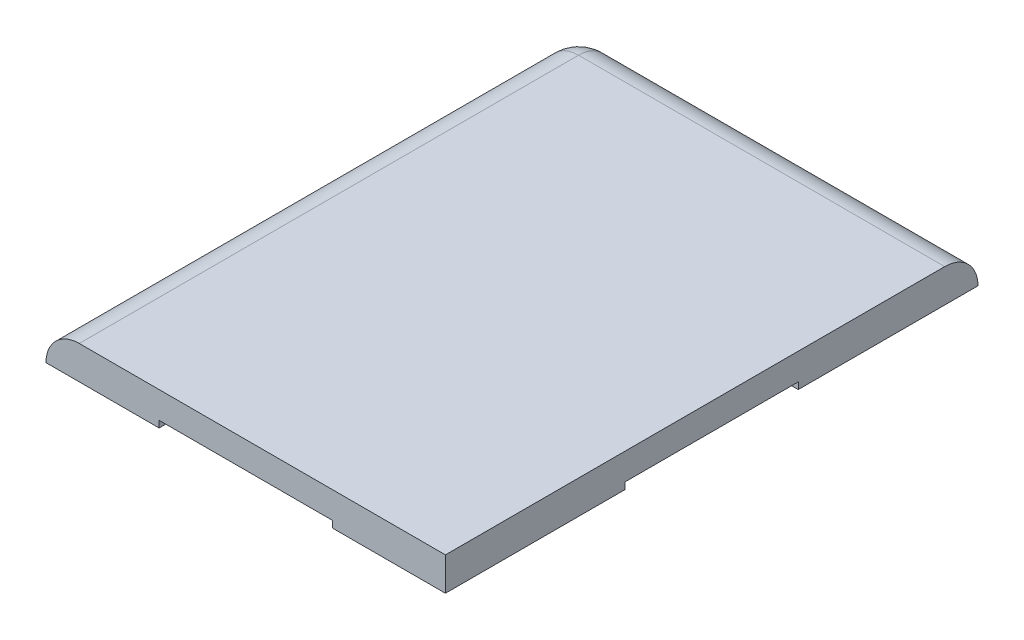
ISO-10303-21;
HEADER;
FILE_DESCRIPTION(('STEP AP214'),'2;1');
FILE_NAME('part.step','',(''),(''),'','','');
FILE_SCHEMA(('AUTOMOTIVE_DESIGN { 1 0 10303 214 1 1 1 1 }'));
ENDSEC;
DATA;
#1=APPLICATION_CONTEXT('core data for automotive mechanical design processes');
#2=APPLICATION_PROTOCOL_DEFINITION('international standard','automotive_design',2000,#1);
#3=PRODUCT_CONTEXT('',#1,'mechanical');
#4=PRODUCT('Part','Part','',(#3));
#5=PRODUCT_RELATED_PRODUCT_CATEGORY('part','',(#4));
#6=PRODUCT_DEFINITION_FORMATION('','',#4);
#7=PRODUCT_DEFINITION_CONTEXT('part definition',#1,'design');
#8=PRODUCT_DEFINITION('design','',#6,#7);
#9=PRODUCT_DEFINITION_SHAPE('','',#8);
#10=(LENGTH_UNIT() NAMED_UNIT(*) SI_UNIT(.MILLI.,.METRE.));
#11=(NAMED_UNIT(*) PLANE_ANGLE_UNIT() SI_UNIT($,.RADIAN.));
#12=(NAMED_UNIT(*) SI_UNIT($,.STERADIAN.) SOLID_ANGLE_UNIT());
#13=UNCERTAINTY_MEASURE_WITH_UNIT(LENGTH_MEASURE(1.E-05),#10,'distance_accuracy_value','');
#14=(GEOMETRIC_REPRESENTATION_CONTEXT(3) GLOBAL_UNCERTAINTY_ASSIGNED_CONTEXT((#13)) GLOBAL_UNIT_ASSIGNED_CONTEXT((#10,
#11,#12)) REPRESENTATION_CONTEXT('',''));
#15=CARTESIAN_POINT('',(0.,0.,0.));
#16=DIRECTION('',(0.,0.,1.));
#17=DIRECTION('',(1.,0.,0.));
#18=AXIS2_PLACEMENT_3D('',#15,#16,#17);
#19=CARTESIAN_POINT('',(0.,10.,0.));
#20=DIRECTION('',(0.,0.,-1.));
#21=DIRECTION('',(-1.,0.,0.));
#22=AXIS2_PLACEMENT_3D('',#19,#20,#21);
#23=PLANE('',#22);
#24=DIRECTION('',(1.,0.,0.));
#25=VECTOR('',#24,1.);
#26=CARTESIAN_POINT('',(0.,0.,0.));
#27=LINE('',#26,#25);
#28=CARTESIAN_POINT('',(0.,0.,0.));
#29=VERTEX_POINT('',#28);
#30=CARTESIAN_POINT('',(34.,0.,0.));
#31=VERTEX_POINT('',#30);
#32=EDGE_CURVE('E206',#29,#31,#27,.T.);
#33=ORIENTED_EDGE('',*,*,#32,.T.);
#34=DIRECTION('',(0.,-1.,0.));
#35=VECTOR('',#34,1.);
#36=CARTESIAN_POINT('',(34.,2.,0.));
#37=LINE('',#36,#35);
#38=CARTESIAN_POINT('',(34.,2.,0.));
#39=VERTEX_POINT('',#38);
#40=EDGE_CURVE('E157',#39,#31,#37,.T.);
#41=ORIENTED_EDGE('',*,*,#40,.F.);
#42=DIRECTION('',(-1.,0.,0.));
#43=VECTOR('',#42,1.);
#44=CARTESIAN_POINT('',(34.,2.,0.));
#45=LINE('',#44,#43);
#46=CARTESIAN_POINT('',(86.,2.,0.));
#47=VERTEX_POINT('',#46);
#48=EDGE_CURVE('E135',#47,#39,#45,.T.);
#49=ORIENTED_EDGE('',*,*,#48,.F.);
#50=DIRECTION('',(0.,-1.,0.));
#51=VECTOR('',#50,1.);
#52=CARTESIAN_POINT('',(86.,2.,0.));
#53=LINE('',#52,#51);
#54=CARTESIAN_POINT('',(86.,0.,0.));
#55=VERTEX_POINT('',#54);
#56=EDGE_CURVE('E160',#47,#55,#53,.T.);
#57=ORIENTED_EDGE('',*,*,#56,.T.);
#58=CARTESIAN_POINT('',(120.,0.,0.));
#59=VERTEX_POINT('',#58);
#60=EDGE_CURVE('E205',#55,#59,#27,.T.);
#61=ORIENTED_EDGE('',*,*,#60,.T.);
#62=DIRECTION('',(0.,-1.,0.));
#63=VECTOR('',#62,1.);
#64=CARTESIAN_POINT('',(120.,10.,0.));
#65=LINE('',#64,#63);
#66=CARTESIAN_POINT('',(120.,10.,0.));
#67=VERTEX_POINT('',#66);
#68=EDGE_CURVE('E202',#67,#59,#65,.T.);
#69=ORIENTED_EDGE('',*,*,#68,.F.);
#70=DIRECTION('',(1.,0.,0.));
#71=VECTOR('',#70,1.);
#72=CARTESIAN_POINT('',(0.,10.,0.));
#73=LINE('',#72,#71);
#74=CARTESIAN_POINT('',(10.,10.,0.));
#75=VERTEX_POINT('',#74);
#76=EDGE_CURVE('E196',#75,#67,#73,.T.);
#77=ORIENTED_EDGE('',*,*,#76,.F.);
#78=CARTESIAN_POINT('',(10.,0.,0.));
#79=DIRECTION('',(0.,0.,-1.));
#80=DIRECTION('',(-1.,0.,0.));
#81=AXIS2_PLACEMENT_3D('',#78,#79,#80);
#82=CIRCLE('',#81,10.);
#83=EDGE_CURVE('E219',#75,#29,#82,.F.);
#84=ORIENTED_EDGE('',*,*,#83,.T.);
#85=EDGE_LOOP('',(#33,#41,#49,#57,#61,#69,#77,#84));
#86=FACE_BOUND('',#85,.T.);
#87=ADVANCED_FACE('F35',(#86),#23,.F.);
#88=CARTESIAN_POINT('',(120.,10.,0.));
#89=DIRECTION('',(-1.,0.,0.));
#90=DIRECTION('',(0.,0.,1.));
#91=AXIS2_PLACEMENT_3D('',#88,#89,#90);
#92=PLANE('',#91);
#93=DIRECTION('',(0.,0.,1.));
#94=VECTOR('',#93,1.);
#95=CARTESIAN_POINT('',(120.,2.,-106.));
#96=LINE('',#95,#94);
#97=CARTESIAN_POINT('',(120.,2.,-106.));
#98=VERTEX_POINT('',#97);
#99=CARTESIAN_POINT('',(120.,2.,-54.));
#100=VERTEX_POINT('',#99);
#101=EDGE_CURVE('E164',#98,#100,#96,.T.);
#102=ORIENTED_EDGE('',*,*,#101,.F.);
#103=DIRECTION('',(0.,-1.,0.));
#104=VECTOR('',#103,1.);
#105=CARTESIAN_POINT('',(120.,2.,-106.));
#106=LINE('',#105,#104);
#107=CARTESIAN_POINT('',(120.,0.,-106.));
#108=VERTEX_POINT('',#107);
#109=EDGE_CURVE('E182',#98,#108,#106,.T.);
#110=ORIENTED_EDGE('',*,*,#109,.T.);
#111=DIRECTION('',(0.,0.,-1.));
#112=VECTOR('',#111,1.);
#113=CARTESIAN_POINT('',(120.,0.,0.));
#114=LINE('',#113,#112);
#115=CARTESIAN_POINT('',(120.,0.,-160.));
#116=VERTEX_POINT('',#115);
#117=EDGE_CURVE('E209',#108,#116,#114,.T.);
#118=ORIENTED_EDGE('',*,*,#117,.T.);
#119=CARTESIAN_POINT('',(120.,0.,-150.));
#120=DIRECTION('',(-1.,0.,0.));
#121=DIRECTION('',(0.,0.,1.));
#122=AXIS2_PLACEMENT_3D('',#119,#120,#121);
#123=CIRCLE('',#122,10.);
#124=CARTESIAN_POINT('',(120.,10.,-150.));
#125=VERTEX_POINT('',#124);
#126=EDGE_CURVE('E11',#116,#125,#123,.F.);
#127=ORIENTED_EDGE('',*,*,#126,.T.);
#128=DIRECTION('',(0.,0.,-1.));
#129=VECTOR('',#128,1.);
#130=CARTESIAN_POINT('',(120.,10.,0.));
#131=LINE('',#130,#129);
#132=EDGE_CURVE('E198',#67,#125,#131,.T.);
#133=ORIENTED_EDGE('',*,*,#132,.F.);
#134=ORIENTED_EDGE('',*,*,#68,.T.);
#135=CARTESIAN_POINT('',(120.,0.,-54.));
#136=VERTEX_POINT('',#135);
#137=EDGE_CURVE('E210',#59,#136,#114,.T.);
#138=ORIENTED_EDGE('',*,*,#137,.T.);
#139=DIRECTION('',(0.,-1.,0.));
#140=VECTOR('',#139,1.);
#141=CARTESIAN_POINT('',(120.,2.,-54.));
#142=LINE('',#141,#140);
#143=EDGE_CURVE('E59',#100,#136,#142,.T.);
#144=ORIENTED_EDGE('',*,*,#143,.F.);
#145=EDGE_LOOP('',(#102,#110,#118,#127,#133,#134,#138,#144));
#146=FACE_BOUND('',#145,.T.);
#147=ADVANCED_FACE('F257',(#146),#92,.F.);
#148=CARTESIAN_POINT('',(0.,10.,0.));
#149=DIRECTION('',(0.,-1.,0.));
#150=DIRECTION('',(0.,0.,-1.));
#151=AXIS2_PLACEMENT_3D('',#148,#149,#150);
#152=PLANE('',#151);
#153=ORIENTED_EDGE('',*,*,#132,.T.);
#154=DIRECTION('',(-1.,0.,0.));
#155=VECTOR('',#154,1.);
#156=CARTESIAN_POINT('',(0.,10.,-150.));
#157=LINE('',#156,#155);
#158=CARTESIAN_POINT('',(10.,10.,-150.));
#159=VERTEX_POINT('',#158);
#160=EDGE_CURVE('E44',#125,#159,#157,.T.);
#161=ORIENTED_EDGE('',*,*,#160,.T.);
#162=DIRECTION('',(0.,0.,1.));
#163=VECTOR('',#162,1.);
#164=CARTESIAN_POINT('',(10.,10.,0.));
#165=LINE('',#164,#163);
#166=EDGE_CURVE('E217',#159,#75,#165,.T.);
#167=ORIENTED_EDGE('',*,*,#166,.T.);
#168=ORIENTED_EDGE('',*,*,#76,.T.);
#169=EDGE_LOOP('',(#153,#161,#167,#168));
#170=FACE_BOUND('',#169,.T.);
#171=ADVANCED_FACE('F230',(#170),#152,.F.);
#172=CARTESIAN_POINT('',(0.,0.,0.));
#173=DIRECTION('',(0.,-1.,0.));
#174=DIRECTION('',(0.,0.,-1.));
#175=AXIS2_PLACEMENT_3D('',#172,#173,#174);
#176=PLANE('',#175);
#177=DIRECTION('',(0.,0.,-1.));
#178=VECTOR('',#177,1.);
#179=CARTESIAN_POINT('',(34.,0.,0.));
#180=LINE('',#179,#178);
#181=CARTESIAN_POINT('',(34.,0.,-11.));
#182=VERTEX_POINT('',#181);
#183=EDGE_CURVE('E51',#31,#182,#180,.T.);
#184=ORIENTED_EDGE('',*,*,#183,.F.);
#185=ORIENTED_EDGE('',*,*,#32,.F.);
#186=DIRECTION('',(0.,0.,1.));
#187=VECTOR('',#186,1.);
#188=CARTESIAN_POINT('',(0.,0.,0.));
#189=LINE('',#188,#187);
#190=CARTESIAN_POINT('',(0.,0.,-150.));
#191=VERTEX_POINT('',#190);
#192=EDGE_CURVE('E203',#191,#29,#189,.T.);
#193=ORIENTED_EDGE('',*,*,#192,.F.);
#194=CARTESIAN_POINT('',(10.,0.,-150.));
#195=DIRECTION('',(0.,-1.,0.));
#196=DIRECTION('',(0.,0.,-1.));
#197=AXIS2_PLACEMENT_3D('',#194,#195,#196);
#198=CIRCLE('',#197,10.);
#199=CARTESIAN_POINT('',(10.,0.,-160.));
#200=VERTEX_POINT('',#199);
#201=EDGE_CURVE('E225',#191,#200,#198,.T.);
#202=ORIENTED_EDGE('',*,*,#201,.T.);
#203=DIRECTION('',(-1.,0.,0.));
#204=VECTOR('',#203,1.);
#205=CARTESIAN_POINT('',(0.,0.,-160.));
#206=LINE('',#205,#204);
#207=EDGE_CURVE('E199',#116,#200,#206,.T.);
#208=ORIENTED_EDGE('',*,*,#207,.F.);
#209=ORIENTED_EDGE('',*,*,#117,.F.);
#210=DIRECTION('',(1.,0.,0.));
#211=VECTOR('',#210,1.);
#212=CARTESIAN_POINT('',(120.,0.,-106.));
#213=LINE('',#212,#211);
#214=CARTESIAN_POINT('',(109.,0.,-106.));
#215=VERTEX_POINT('',#214);
#216=EDGE_CURVE('E168',#215,#108,#213,.T.);
#217=ORIENTED_EDGE('',*,*,#216,.F.);
#218=DIRECTION('',(0.,0.,-1.));
#219=VECTOR('',#218,1.);
#220=CARTESIAN_POINT('',(109.,0.,-106.));
#221=LINE('',#220,#219);
#222=CARTESIAN_POINT('',(109.,0.,-54.));
#223=VERTEX_POINT('',#222);
#224=EDGE_CURVE('E178',#223,#215,#221,.T.);
#225=ORIENTED_EDGE('',*,*,#224,.F.);
#226=DIRECTION('',(-1.,0.,0.));
#227=VECTOR('',#226,1.);
#228=CARTESIAN_POINT('',(120.,0.,-54.));
#229=LINE('',#228,#227);
#230=EDGE_CURVE('E159',#136,#223,#229,.T.);
#231=ORIENTED_EDGE('',*,*,#230,.F.);
#232=ORIENTED_EDGE('',*,*,#137,.F.);
#233=ORIENTED_EDGE('',*,*,#60,.F.);
#234=DIRECTION('',(0.,0.,1.));
#235=VECTOR('',#234,1.);
#236=CARTESIAN_POINT('',(86.,0.,0.));
#237=LINE('',#236,#235);
#238=CARTESIAN_POINT('',(86.,0.,-11.));
#239=VERTEX_POINT('',#238);
#240=EDGE_CURVE('E148',#239,#55,#237,.T.);
#241=ORIENTED_EDGE('',*,*,#240,.F.);
#242=DIRECTION('',(1.,0.,0.));
#243=VECTOR('',#242,1.);
#244=CARTESIAN_POINT('',(34.,0.,-11.));
#245=LINE('',#244,#243);
#246=EDGE_CURVE('E150',#182,#239,#245,.T.);
#247=ORIENTED_EDGE('',*,*,#246,.F.);
#248=EDGE_LOOP('',(#184,#185,#193,#202,#208,#209,#217,#225,#231,#232,#233,#241,#247));
#249=FACE_BOUND('',#248,.T.);
#250=CARTESIAN_POINT('',(8.,0.,-152.));
#251=DIRECTION('',(0.,-1.,0.));
#252=DIRECTION('',(0.,0.,-1.));
#253=AXIS2_PLACEMENT_3D('',#250,#251,#252);
#254=CIRCLE('',#253,2.5);
#255=CARTESIAN_POINT('',(8.,0.,-154.5));
#256=VERTEX_POINT('',#255);
#257=EDGE_CURVE('E185',#256,#256,#254,.T.);
#258=ORIENTED_EDGE('',*,*,#257,.F.);
#259=EDGE_LOOP('',(#258));
#260=FACE_BOUND('',#259,.T.);
#261=ADVANCED_FACE('F247',(#249,#260),#176,.T.);
#262=CARTESIAN_POINT('',(10.,0.,0.));
#263=DIRECTION('',(0.,0.,1.));
#264=DIRECTION('',(1.,0.,0.));
#265=AXIS2_PLACEMENT_3D('',#262,#263,#264);
#266=CYLINDRICAL_SURFACE('',#265,10.);
#267=ORIENTED_EDGE('',*,*,#166,.F.);
#268=CARTESIAN_POINT('',(10.,0.,-150.));
#269=DIRECTION('',(0.,0.,1.));
#270=DIRECTION('',(1.,0.,0.));
#271=AXIS2_PLACEMENT_3D('',#268,#269,#270);
#272=CIRCLE('',#271,10.);
#273=EDGE_CURVE('E222',#159,#191,#272,.T.);
#274=ORIENTED_EDGE('',*,*,#273,.T.);
#275=ORIENTED_EDGE('',*,*,#192,.T.);
#276=ORIENTED_EDGE('',*,*,#83,.F.);
#277=EDGE_LOOP('',(#267,#274,#275,#276));
#278=FACE_BOUND('',#277,.T.);
#279=ADVANCED_FACE('F238',(#278),#266,.T.);
#280=CARTESIAN_POINT('',(0.,0.,-150.));
#281=DIRECTION('',(-1.,0.,0.));
#282=DIRECTION('',(0.,0.,1.));
#283=AXIS2_PLACEMENT_3D('',#280,#281,#282);
#284=CYLINDRICAL_SURFACE('',#283,10.);
#285=ORIENTED_EDGE('',*,*,#126,.F.);
#286=ORIENTED_EDGE('',*,*,#207,.T.);
#287=CARTESIAN_POINT('',(10.,0.,-150.));
#288=DIRECTION('',(-1.,0.,0.));
#289=DIRECTION('',(0.,0.,1.));
#290=AXIS2_PLACEMENT_3D('',#287,#288,#289);
#291=CIRCLE('',#290,10.);
#292=EDGE_CURVE('E39',#159,#200,#291,.T.);
#293=ORIENTED_EDGE('',*,*,#292,.F.);
#294=ORIENTED_EDGE('',*,*,#160,.F.);
#295=EDGE_LOOP('',(#285,#286,#293,#294));
#296=FACE_BOUND('',#295,.T.);
#297=ADVANCED_FACE('F37',(#296),#284,.T.);
#298=CARTESIAN_POINT('',(10.,0.,-150.));
#299=DIRECTION('',(0.,0.,1.));
#300=DIRECTION('',(1.,0.,0.));
#301=AXIS2_PLACEMENT_3D('',#298,#299,#300);
#302=SPHERICAL_SURFACE('',#301,10.);
#303=ORIENTED_EDGE('',*,*,#201,.F.);
#304=ORIENTED_EDGE('',*,*,#273,.F.);
#305=ORIENTED_EDGE('',*,*,#292,.T.);
#306=EDGE_LOOP('',(#303,#304,#305));
#307=FACE_BOUND('',#306,.T.);
#308=ADVANCED_FACE('F243',(#307),#302,.T.);
#309=CARTESIAN_POINT('',(8.,-30.,-152.));
#310=DIRECTION('',(0.,1.,0.));
#311=DIRECTION('',(0.,0.,1.));
#312=AXIS2_PLACEMENT_3D('',#309,#310,#311);
#313=CYLINDRICAL_SURFACE('',#312,2.5);
#314=CARTESIAN_POINT('',(8.,-30.,-152.));
#315=DIRECTION('',(0.,-1.,0.));
#316=DIRECTION('',(0.,0.,-1.));
#317=AXIS2_PLACEMENT_3D('',#314,#315,#316);
#318=CIRCLE('',#317,2.5);
#319=CARTESIAN_POINT('',(8.,-30.,-154.5));
#320=VERTEX_POINT('',#319);
#321=EDGE_CURVE('E191',#320,#320,#318,.T.);
#322=ORIENTED_EDGE('',*,*,#321,.F.);
#323=EDGE_LOOP('',(#322));
#324=FACE_BOUND('',#323,.T.);
#325=ORIENTED_EDGE('',*,*,#257,.T.);
#326=EDGE_LOOP('',(#325));
#327=FACE_BOUND('',#326,.T.);
#328=ADVANCED_FACE('F287',(#324,#327),#313,.T.);
#329=CARTESIAN_POINT('',(8.,-30.,-152.));
#330=DIRECTION('',(0.,-1.,0.));
#331=DIRECTION('',(0.,0.,-1.));
#332=AXIS2_PLACEMENT_3D('',#329,#330,#331);
#333=PLANE('',#332);
#334=ORIENTED_EDGE('',*,*,#321,.T.);
#335=EDGE_LOOP('',(#334));
#336=FACE_BOUND('',#335,.T.);
#337=ADVANCED_FACE('F292',(#336),#333,.T.);
#338=CARTESIAN_POINT('',(120.,2.,-106.));
#339=DIRECTION('',(0.,0.,-1.));
#340=DIRECTION('',(-1.,0.,0.));
#341=AXIS2_PLACEMENT_3D('',#338,#339,#340);
#342=PLANE('',#341);
#343=ORIENTED_EDGE('',*,*,#216,.T.);
#344=ORIENTED_EDGE('',*,*,#109,.F.);
#345=DIRECTION('',(1.,0.,0.));
#346=VECTOR('',#345,1.);
#347=CARTESIAN_POINT('',(120.,2.,-106.));
#348=LINE('',#347,#346);
#349=CARTESIAN_POINT('',(109.,2.,-106.));
#350=VERTEX_POINT('',#349);
#351=EDGE_CURVE('E174',#350,#98,#348,.T.);
#352=ORIENTED_EDGE('',*,*,#351,.F.);
#353=DIRECTION('',(0.,-1.,0.));
#354=VECTOR('',#353,1.);
#355=CARTESIAN_POINT('',(109.,2.,-106.));
#356=LINE('',#355,#354);
#357=EDGE_CURVE('E186',#350,#215,#356,.T.);
#358=ORIENTED_EDGE('',*,*,#357,.T.);
#359=EDGE_LOOP('',(#343,#344,#352,#358));
#360=FACE_BOUND('',#359,.T.);
#361=ADVANCED_FACE('F260',(#360),#342,.F.);
#362=CARTESIAN_POINT('',(109.,2.,-106.));
#363=DIRECTION('',(-1.,0.,0.));
#364=DIRECTION('',(0.,0.,1.));
#365=AXIS2_PLACEMENT_3D('',#362,#363,#364);
#366=PLANE('',#365);
#367=ORIENTED_EDGE('',*,*,#224,.T.);
#368=ORIENTED_EDGE('',*,*,#357,.F.);
#369=DIRECTION('',(0.,0.,-1.));
#370=VECTOR('',#369,1.);
#371=CARTESIAN_POINT('',(109.,2.,-106.));
#372=LINE('',#371,#370);
#373=CARTESIAN_POINT('',(109.,2.,-54.));
#374=VERTEX_POINT('',#373);
#375=EDGE_CURVE('E171',#374,#350,#372,.T.);
#376=ORIENTED_EDGE('',*,*,#375,.F.);
#377=DIRECTION('',(0.,-1.,0.));
#378=VECTOR('',#377,1.);
#379=CARTESIAN_POINT('',(109.,2.,-54.));
#380=LINE('',#379,#378);
#381=EDGE_CURVE('E188',#374,#223,#380,.T.);
#382=ORIENTED_EDGE('',*,*,#381,.T.);
#383=EDGE_LOOP('',(#367,#368,#376,#382));
#384=FACE_BOUND('',#383,.T.);
#385=ADVANCED_FACE('F265',(#384),#366,.F.);
#386=CARTESIAN_POINT('',(120.,2.,-54.));
#387=DIRECTION('',(0.,0.,1.));
#388=DIRECTION('',(1.,0.,0.));
#389=AXIS2_PLACEMENT_3D('',#386,#387,#388);
#390=PLANE('',#389);
#391=ORIENTED_EDGE('',*,*,#230,.T.);
#392=ORIENTED_EDGE('',*,*,#381,.F.);
#393=DIRECTION('',(-1.,0.,0.));
#394=VECTOR('',#393,1.);
#395=CARTESIAN_POINT('',(120.,2.,-54.));
#396=LINE('',#395,#394);
#397=EDGE_CURVE('E167',#100,#374,#396,.T.);
#398=ORIENTED_EDGE('',*,*,#397,.F.);
#399=ORIENTED_EDGE('',*,*,#143,.T.);
#400=EDGE_LOOP('',(#391,#392,#398,#399));
#401=FACE_BOUND('',#400,.T.);
#402=ADVANCED_FACE('F267',(#401),#390,.F.);
#403=CARTESIAN_POINT('',(0.,2.,0.));
#404=DIRECTION('',(0.,-1.,0.));
#405=DIRECTION('',(0.,0.,-1.));
#406=AXIS2_PLACEMENT_3D('',#403,#404,#405);
#407=PLANE('',#406);
#408=ORIENTED_EDGE('',*,*,#101,.T.);
#409=ORIENTED_EDGE('',*,*,#397,.T.);
#410=ORIENTED_EDGE('',*,*,#375,.T.);
#411=ORIENTED_EDGE('',*,*,#351,.T.);
#412=EDGE_LOOP('',(#408,#409,#410,#411));
#413=FACE_BOUND('',#412,.T.);
#414=ADVANCED_FACE('F262',(#413),#407,.T.);
#415=CARTESIAN_POINT('',(34.,2.,0.));
#416=DIRECTION('',(-1.,0.,0.));
#417=DIRECTION('',(0.,0.,1.));
#418=AXIS2_PLACEMENT_3D('',#415,#416,#417);
#419=PLANE('',#418);
#420=ORIENTED_EDGE('',*,*,#183,.T.);
#421=DIRECTION('',(0.,-1.,0.));
#422=VECTOR('',#421,1.);
#423=CARTESIAN_POINT('',(34.,2.,-11.));
#424=LINE('',#423,#422);
#425=CARTESIAN_POINT('',(34.,2.,-11.));
#426=VERTEX_POINT('',#425);
#427=EDGE_CURVE('E125',#426,#182,#424,.T.);
#428=ORIENTED_EDGE('',*,*,#427,.F.);
#429=DIRECTION('',(0.,0.,-1.));
#430=VECTOR('',#429,1.);
#431=CARTESIAN_POINT('',(34.,2.,0.));
#432=LINE('',#431,#430);
#433=EDGE_CURVE('E129',#39,#426,#432,.T.);
#434=ORIENTED_EDGE('',*,*,#433,.F.);
#435=ORIENTED_EDGE('',*,*,#40,.T.);
#436=EDGE_LOOP('',(#420,#428,#434,#435));
#437=FACE_BOUND('',#436,.T.);
#438=ADVANCED_FACE('F127',(#437),#419,.F.);
#439=CARTESIAN_POINT('',(86.,2.,0.));
#440=DIRECTION('',(1.,0.,0.));
#441=DIRECTION('',(0.,0.,-1.));
#442=AXIS2_PLACEMENT_3D('',#439,#440,#441);
#443=PLANE('',#442);
#444=ORIENTED_EDGE('',*,*,#240,.T.);
#445=ORIENTED_EDGE('',*,*,#56,.F.);
#446=DIRECTION('',(0.,0.,1.));
#447=VECTOR('',#446,1.);
#448=CARTESIAN_POINT('',(86.,2.,0.));
#449=LINE('',#448,#447);
#450=CARTESIAN_POINT('',(86.,2.,-11.));
#451=VERTEX_POINT('',#450);
#452=EDGE_CURVE('E143',#451,#47,#449,.T.);
#453=ORIENTED_EDGE('',*,*,#452,.F.);
#454=DIRECTION('',(0.,-1.,0.));
#455=VECTOR('',#454,1.);
#456=CARTESIAN_POINT('',(86.,2.,-11.));
#457=LINE('',#456,#455);
#458=EDGE_CURVE('E134',#451,#239,#457,.T.);
#459=ORIENTED_EDGE('',*,*,#458,.T.);
#460=EDGE_LOOP('',(#444,#445,#453,#459));
#461=FACE_BOUND('',#460,.T.);
#462=ADVANCED_FACE('F379',(#461),#443,.F.);
#463=CARTESIAN_POINT('',(34.,2.,-11.));
#464=DIRECTION('',(0.,0.,-1.));
#465=DIRECTION('',(-1.,0.,0.));
#466=AXIS2_PLACEMENT_3D('',#463,#464,#465);
#467=PLANE('',#466);
#468=ORIENTED_EDGE('',*,*,#246,.T.);
#469=ORIENTED_EDGE('',*,*,#458,.F.);
#470=DIRECTION('',(1.,0.,0.));
#471=VECTOR('',#470,1.);
#472=CARTESIAN_POINT('',(34.,2.,-11.));
#473=LINE('',#472,#471);
#474=EDGE_CURVE('E138',#426,#451,#473,.T.);
#475=ORIENTED_EDGE('',*,*,#474,.F.);
#476=ORIENTED_EDGE('',*,*,#427,.T.);
#477=EDGE_LOOP('',(#468,#469,#475,#476));
#478=FACE_BOUND('',#477,.T.);
#479=ADVANCED_FACE('F139',(#478),#467,.F.);
#480=CARTESIAN_POINT('',(0.,2.,0.));
#481=DIRECTION('',(0.,-1.,0.));
#482=DIRECTION('',(0.,0.,-1.));
#483=AXIS2_PLACEMENT_3D('',#480,#481,#482);
#484=PLANE('',#483);
#485=ORIENTED_EDGE('',*,*,#433,.T.);
#486=ORIENTED_EDGE('',*,*,#474,.T.);
#487=ORIENTED_EDGE('',*,*,#452,.T.);
#488=ORIENTED_EDGE('',*,*,#48,.T.);
#489=EDGE_LOOP('',(#485,#486,#487,#488));
#490=FACE_BOUND('',#489,.T.);
#491=ADVANCED_FACE('F145',(#490),#484,.T.);
#492=CLOSED_SHELL('',(#87,#147,#171,#261,#279,#297,#308,#328,#337,#361,#385,#402,#414,#438,#462,
#479,#491));
#493=MANIFOLD_SOLID_BREP('B2',#492);
#494=ADVANCED_BREP_SHAPE_REPRESENTATION('',(#18,#493),#14);
#495=SHAPE_DEFINITION_REPRESENTATION(#9,#494);
ENDSEC;
END-ISO-10303-21;
